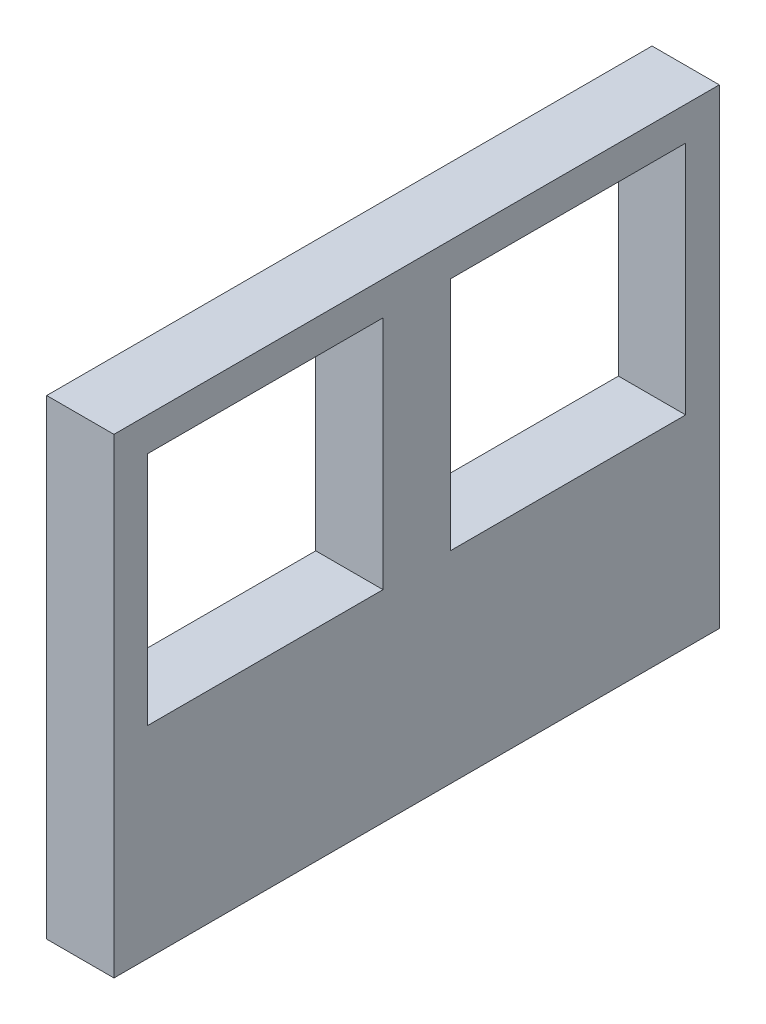
ISO-10303-21;
HEADER;
FILE_DESCRIPTION(('STEP AP214'),'2;1');
FILE_NAME('part.step','',(''),(''),'','','');
FILE_SCHEMA(('AUTOMOTIVE_DESIGN { 1 0 10303 214 1 1 1 1 }'));
ENDSEC;
DATA;
#1=APPLICATION_CONTEXT('core data for automotive mechanical design processes');
#2=APPLICATION_PROTOCOL_DEFINITION('international standard','automotive_design',2000,#1);
#3=PRODUCT_CONTEXT('',#1,'mechanical');
#4=PRODUCT('Part','Part','',(#3));
#5=PRODUCT_RELATED_PRODUCT_CATEGORY('part','',(#4));
#6=PRODUCT_DEFINITION_FORMATION('','',#4);
#7=PRODUCT_DEFINITION_CONTEXT('part definition',#1,'design');
#8=PRODUCT_DEFINITION('design','',#6,#7);
#9=PRODUCT_DEFINITION_SHAPE('','',#8);
#10=(LENGTH_UNIT() NAMED_UNIT(*) SI_UNIT(.MILLI.,.METRE.));
#11=(NAMED_UNIT(*) PLANE_ANGLE_UNIT() SI_UNIT($,.RADIAN.));
#12=(NAMED_UNIT(*) SI_UNIT($,.STERADIAN.) SOLID_ANGLE_UNIT());
#13=UNCERTAINTY_MEASURE_WITH_UNIT(LENGTH_MEASURE(1.E-05),#10,'distance_accuracy_value','');
#14=(GEOMETRIC_REPRESENTATION_CONTEXT(3) GLOBAL_UNCERTAINTY_ASSIGNED_CONTEXT((#13)) GLOBAL_UNIT_ASSIGNED_CONTEXT((#10,
#11,#12)) REPRESENTATION_CONTEXT('',''));
#15=CARTESIAN_POINT('',(0.,0.,0.));
#16=DIRECTION('',(0.,0.,1.));
#17=DIRECTION('',(1.,0.,0.));
#18=AXIS2_PLACEMENT_3D('',#15,#16,#17);
#19=CARTESIAN_POINT('',(4.00000000100669,0.,0.));
#20=DIRECTION('',(1.,-1.53139024142648E-11,1.01128581309604E-11));
#21=DIRECTION('',(1.53139024142648E-11,1.,0.));
#22=AXIS2_PLACEMENT_3D('',#19,#20,#21);
#23=PLANE('',#22);
#24=DIRECTION('',(1.53547098167227E-11,1.,0.));
#25=VECTOR('',#24,1.);
#26=CARTESIAN_POINT('',(4.00000000073447,-27.529244173444,5.24235772495873));
#27=LINE('',#26,#25);
#28=CARTESIAN_POINT('',(4.00000000073447,-27.529244173444,5.24235772495873));
#29=VERTEX_POINT('',#28);
#30=CARTESIAN_POINT('',(4.00000000074649,-13.529244173444,5.24235772495794));
#31=VERTEX_POINT('',#30);
#32=EDGE_CURVE('E166',#29,#31,#27,.T.);
#33=ORIENTED_EDGE('',*,*,#32,.F.);
#34=DIRECTION('',(1.06786305254557E-11,0.,-1.));
#35=VECTOR('',#34,1.);
#36=CARTESIAN_POINT('',(4.00000000073447,-27.529244173444,5.24235772495873));
#37=LINE('',#36,#35);
#38=CARTESIAN_POINT('',(4.00000000058497,-27.5292441734432,19.2423577249587));
#39=VERTEX_POINT('',#38);
#40=EDGE_CURVE('E143',#39,#29,#37,.T.);
#41=ORIENTED_EDGE('',*,*,#40,.F.);
#42=DIRECTION('',(-1.53547098167227E-11,-1.,0.));
#43=VECTOR('',#42,1.);
#44=CARTESIAN_POINT('',(4.00000000058497,-27.5292441734432,19.2423577249587));
#45=LINE('',#44,#43);
#46=CARTESIAN_POINT('',(4.00000000079993,-13.5292441734432,19.2423577249579));
#47=VERTEX_POINT('',#46);
#48=EDGE_CURVE('E136',#47,#39,#45,.T.);
#49=ORIENTED_EDGE('',*,*,#48,.F.);
#50=DIRECTION('',(-1.06786305254557E-11,0.,1.));
#51=VECTOR('',#50,1.);
#52=CARTESIAN_POINT('',(4.00000000094943,-13.529244173444,5.24235772495794));
#53=LINE('',#52,#51);
#54=EDGE_CURVE('E125',#31,#47,#53,.T.);
#55=ORIENTED_EDGE('',*,*,#54,.F.);
#56=EDGE_LOOP('',(#33,#41,#49,#55));
#57=FACE_BOUND('',#56,.T.);
#58=DIRECTION('',(1.53547096352157E-11,1.,0.));
#59=VECTOR('',#58,1.);
#60=CARTESIAN_POINT('',(4.00000000092668,-27.529244173445,-12.7576422750412));
#61=LINE('',#60,#59);
#62=CARTESIAN_POINT('',(4.00000000092668,-27.529244173445,-12.7576422750412));
#63=VERTEX_POINT('',#62);
#64=CARTESIAN_POINT('',(4.00000000092852,-13.529244173445,-12.757642275042));
#65=VERTEX_POINT('',#64);
#66=EDGE_CURVE('E198',#63,#65,#61,.T.);
#67=ORIENTED_EDGE('',*,*,#66,.F.);
#68=DIRECTION('',(1.06786305254557E-11,0.,-1.));
#69=VECTOR('',#68,1.);
#70=CARTESIAN_POINT('',(4.00000000092668,-27.529244173445,-12.7576422750412));
#71=LINE('',#70,#69);
#72=CARTESIAN_POINT('',(4.00000000077718,-27.5292441734443,1.24235772495875));
#73=VERTEX_POINT('',#72);
#74=EDGE_CURVE('E171',#73,#63,#71,.T.);
#75=ORIENTED_EDGE('',*,*,#74,.F.);
#76=DIRECTION('',(-1.53547096352157E-11,-1.,0.));
#77=VECTOR('',#76,1.);
#78=CARTESIAN_POINT('',(4.00000000077718,-27.5292441734442,1.24235772495875));
#79=LINE('',#78,#77);
#80=CARTESIAN_POINT('',(4.00000000099215,-13.5292441734442,1.24235772495796));
#81=VERTEX_POINT('',#80);
#82=EDGE_CURVE('E191',#81,#73,#79,.T.);
#83=ORIENTED_EDGE('',*,*,#82,.F.);
#84=DIRECTION('',(-1.06786305254557E-11,0.,1.));
#85=VECTOR('',#84,1.);
#86=CARTESIAN_POINT('',(4.00000000114165,-13.529244173445,-12.757642275042));
#87=LINE('',#86,#85);
#88=EDGE_CURVE('E184',#65,#81,#87,.T.);
#89=ORIENTED_EDGE('',*,*,#88,.F.);
#90=EDGE_LOOP('',(#67,#75,#83,#89));
#91=FACE_BOUND('',#90,.T.);
#92=DIRECTION('',(1.53545343286841E-11,1.,0.));
#93=VECTOR('',#92,1.);
#94=CARTESIAN_POINT('',(4.00000000037936,-39.5292441734502,21.2423577249608));
#95=LINE('',#94,#93);
#96=CARTESIAN_POINT('',(4.00000000037936,-39.5292441734502,21.2423577249608));
#97=VERTEX_POINT('',#96);
#98=CARTESIAN_POINT('',(4.00000000080929,-11.5292441734504,21.2423577249592));
#99=VERTEX_POINT('',#98);
#100=EDGE_CURVE('E46',#97,#99,#95,.T.);
#101=ORIENTED_EDGE('',*,*,#100,.F.);
#102=DIRECTION('',(-1.06783779595951E-11,0.,1.));
#103=VECTOR('',#102,1.);
#104=CARTESIAN_POINT('',(4.00000000076378,-39.5292441734522,-14.7576422750417));
#105=LINE('',#104,#103);
#106=CARTESIAN_POINT('',(4.00000000076378,-39.5292441734522,-14.7576422750417));
#107=VERTEX_POINT('',#106);
#108=EDGE_CURVE('E183',#107,#97,#105,.T.);
#109=ORIENTED_EDGE('',*,*,#108,.F.);
#110=DIRECTION('',(-1.53546596069565E-11,-1.,0.));
#111=VECTOR('',#110,1.);
#112=CARTESIAN_POINT('',(4.00000000076378,-39.5292441734522,-14.7576422750417));
#113=LINE('',#112,#111);
#114=CARTESIAN_POINT('',(4.00000000119371,-11.5292441734525,-14.7576422750433));
#115=VERTEX_POINT('',#114);
#116=EDGE_CURVE('E229',#115,#107,#113,.T.);
#117=ORIENTED_EDGE('',*,*,#116,.F.);
#118=DIRECTION('',(1.06784753982515E-11,0.,-1.));
#119=VECTOR('',#118,1.);
#120=CARTESIAN_POINT('',(4.00000000119371,-11.5292441734525,-14.7576422750433));
#121=LINE('',#120,#119);
#122=EDGE_CURVE('E244',#99,#115,#121,.T.);
#123=ORIENTED_EDGE('',*,*,#122,.F.);
#124=EDGE_LOOP('',(#101,#109,#117,#123));
#125=FACE_BOUND('',#124,.T.);
#126=ADVANCED_FACE('F38',(#57,#91,#125),#23,.T.);
#127=CARTESIAN_POINT('',(1.00668872198654E-09,0.,0.));
#128=DIRECTION('',(1.,-1.53139024142648E-11,1.01128581309604E-11));
#129=DIRECTION('',(1.53139024142648E-11,1.,0.));
#130=AXIS2_PLACEMENT_3D('',#127,#128,#129);
#131=PLANE('',#130);
#132=DIRECTION('',(1.06786305254557E-11,0.,-1.));
#133=VECTOR('',#132,1.);
#134=CARTESIAN_POINT('',(7.34468521226502E-10,-27.529244173444,5.24235772495873));
#135=LINE('',#134,#133);
#136=CARTESIAN_POINT('',(5.84967693870122E-10,-27.5292441734432,19.2423577249587));
#137=VERTEX_POINT('',#136);
#138=CARTESIAN_POINT('',(7.34468521226502E-10,-27.529244173444,5.24235772495873));
#139=VERTEX_POINT('',#138);
#140=EDGE_CURVE('E144',#137,#139,#135,.T.);
#141=ORIENTED_EDGE('',*,*,#140,.T.);
#142=DIRECTION('',(1.53547098167227E-11,1.,0.));
#143=VECTOR('',#142,1.);
#144=CARTESIAN_POINT('',(7.34468521226502E-10,-27.529244173444,5.24235772495873));
#145=LINE('',#144,#143);
#146=CARTESIAN_POINT('',(9.4943445866062E-10,-13.529244173444,5.24235772495794));
#147=VERTEX_POINT('',#146);
#148=EDGE_CURVE('E165',#139,#147,#145,.T.);
#149=ORIENTED_EDGE('',*,*,#148,.T.);
#150=DIRECTION('',(-1.06786305254557E-11,0.,1.));
#151=VECTOR('',#150,1.);
#152=CARTESIAN_POINT('',(9.4943445866062E-10,-13.529244173444,5.24235772495794));
#153=LINE('',#152,#151);
#154=CARTESIAN_POINT('',(6.04907963197976E-10,-13.5292441734432,19.2423577249579));
#155=VERTEX_POINT('',#154);
#156=EDGE_CURVE('E130',#147,#155,#153,.T.);
#157=ORIENTED_EDGE('',*,*,#156,.T.);
#158=DIRECTION('',(-1.53547098167227E-11,-1.,0.));
#159=VECTOR('',#158,1.);
#160=CARTESIAN_POINT('',(5.84967693870122E-10,-27.5292441734432,19.2423577249587));
#161=LINE('',#160,#159);
#162=EDGE_CURVE('E131',#155,#137,#161,.T.);
#163=ORIENTED_EDGE('',*,*,#162,.T.);
#164=EDGE_LOOP('',(#141,#149,#157,#163));
#165=FACE_BOUND('',#164,.T.);
#166=DIRECTION('',(1.06786305254557E-11,0.,-1.));
#167=VECTOR('',#166,1.);
#168=CARTESIAN_POINT('',(9.26684423609647E-10,-27.529244173445,-12.7576422750412));
#169=LINE('',#168,#167);
#170=CARTESIAN_POINT('',(7.77183596253268E-10,-27.5292441734443,1.24235772495875));
#171=VERTEX_POINT('',#170);
#172=CARTESIAN_POINT('',(9.26684423609647E-10,-27.529244173445,-12.7576422750412));
#173=VERTEX_POINT('',#172);
#174=EDGE_CURVE('E207',#171,#173,#169,.T.);
#175=ORIENTED_EDGE('',*,*,#174,.T.);
#176=DIRECTION('',(1.53547096352157E-11,1.,0.));
#177=VECTOR('',#176,1.);
#178=CARTESIAN_POINT('',(9.26684423609647E-10,-27.529244173445,-12.7576422750412));
#179=LINE('',#178,#177);
#180=CARTESIAN_POINT('',(1.14165035850267E-09,-13.529244173445,-12.757642275042));
#181=VERTEX_POINT('',#180);
#182=EDGE_CURVE('E172',#173,#181,#179,.T.);
#183=ORIENTED_EDGE('',*,*,#182,.T.);
#184=DIRECTION('',(-1.06786305254557E-11,0.,1.));
#185=VECTOR('',#184,1.);
#186=CARTESIAN_POINT('',(1.14165035850267E-09,-13.529244173445,-12.757642275042));
#187=LINE('',#186,#185);
#188=CARTESIAN_POINT('',(7.86939409555247E-10,-13.5292441734442,1.24235772495796));
#189=VERTEX_POINT('',#188);
#190=EDGE_CURVE('E180',#181,#189,#187,.T.);
#191=ORIENTED_EDGE('',*,*,#190,.T.);
#192=DIRECTION('',(-1.53547096352157E-11,-1.,0.));
#193=VECTOR('',#192,1.);
#194=CARTESIAN_POINT('',(7.77183596253268E-10,-27.5292441734442,1.24235772495875));
#195=LINE('',#194,#193);
#196=EDGE_CURVE('E190',#189,#171,#195,.T.);
#197=ORIENTED_EDGE('',*,*,#196,.T.);
#198=EDGE_LOOP('',(#175,#183,#191,#197));
#199=FACE_BOUND('',#198,.T.);
#200=DIRECTION('',(1.53545343286841E-11,1.,0.));
#201=VECTOR('',#200,1.);
#202=CARTESIAN_POINT('',(3.79359720536706E-10,-39.5292441734502,21.2423577249608));
#203=LINE('',#202,#201);
#204=CARTESIAN_POINT('',(3.79359720536706E-10,-39.5292441734502,21.2423577249608));
#205=VERTEX_POINT('',#204);
#206=CARTESIAN_POINT('',(8.09286681739858E-10,-11.5292441734504,21.2423577249592));
#207=VERTEX_POINT('',#206);
#208=EDGE_CURVE('E12',#205,#207,#203,.T.);
#209=ORIENTED_EDGE('',*,*,#208,.T.);
#210=DIRECTION('',(1.06784753982515E-11,0.,-1.));
#211=VECTOR('',#210,1.);
#212=CARTESIAN_POINT('',(1.19371179607694E-09,-11.5292441734525,-14.7576422750433));
#213=LINE('',#212,#211);
#214=CARTESIAN_POINT('',(1.19371179607694E-09,-11.5292441734525,-14.7576422750433));
#215=VERTEX_POINT('',#214);
#216=EDGE_CURVE('E243',#207,#215,#213,.T.);
#217=ORIENTED_EDGE('',*,*,#216,.T.);
#218=DIRECTION('',(-1.53546596069565E-11,-1.,0.));
#219=VECTOR('',#218,1.);
#220=CARTESIAN_POINT('',(7.63781327082158E-10,-39.5292441734522,-14.7576422750417));
#221=LINE('',#220,#219);
#222=CARTESIAN_POINT('',(7.63781327082158E-10,-39.5292441734522,-14.7576422750417));
#223=VERTEX_POINT('',#222);
#224=EDGE_CURVE('E258',#215,#223,#221,.T.);
#225=ORIENTED_EDGE('',*,*,#224,.T.);
#226=DIRECTION('',(-1.06783779595951E-11,0.,1.));
#227=VECTOR('',#226,1.);
#228=CARTESIAN_POINT('',(7.63781327082158E-10,-39.5292441734522,-14.7576422750417));
#229=LINE('',#228,#227);
#230=EDGE_CURVE('E230',#223,#205,#229,.T.);
#231=ORIENTED_EDGE('',*,*,#230,.T.);
#232=EDGE_LOOP('',(#209,#217,#225,#231));
#233=FACE_BOUND('',#232,.T.);
#234=ADVANCED_FACE('F290',(#165,#199,#233),#131,.F.);
#235=CARTESIAN_POINT('',(7.63781327082158E-10,-39.5292441734522,-14.7576422750417));
#236=DIRECTION('',(0.,1.,0.));
#237=DIRECTION('',(0.,0.,1.));
#238=AXIS2_PLACEMENT_3D('',#235,#236,#237);
#239=PLANE('',#238);
#240=ORIENTED_EDGE('',*,*,#108,.T.);
#241=DIRECTION('',(1.,0.,0.));
#242=VECTOR('',#241,1.);
#243=CARTESIAN_POINT('',(3.79359720536706E-10,-39.5292441734502,21.2423577249608));
#244=LINE('',#243,#242);
#245=EDGE_CURVE('E226',#205,#97,#244,.T.);
#246=ORIENTED_EDGE('',*,*,#245,.F.);
#247=ORIENTED_EDGE('',*,*,#230,.F.);
#248=DIRECTION('',(1.,0.,0.));
#249=VECTOR('',#248,1.);
#250=CARTESIAN_POINT('',(7.63781327082158E-10,-39.5292441734522,-14.7576422750417));
#251=LINE('',#250,#249);
#252=EDGE_CURVE('E235',#223,#107,#251,.T.);
#253=ORIENTED_EDGE('',*,*,#252,.T.);
#254=EDGE_LOOP('',(#240,#246,#247,#253));
#255=FACE_BOUND('',#254,.T.);
#256=ADVANCED_FACE('F276',(#255),#239,.F.);
#257=CARTESIAN_POINT('',(7.63781327082158E-10,-39.5292441734522,-14.7576422750417));
#258=DIRECTION('',(0.,0.,1.));
#259=DIRECTION('',(0.,-1.,0.));
#260=AXIS2_PLACEMENT_3D('',#257,#258,#259);
#261=PLANE('',#260);
#262=ORIENTED_EDGE('',*,*,#116,.T.);
#263=ORIENTED_EDGE('',*,*,#252,.F.);
#264=ORIENTED_EDGE('',*,*,#224,.F.);
#265=DIRECTION('',(1.,0.,0.));
#266=VECTOR('',#265,1.);
#267=CARTESIAN_POINT('',(1.19371179607694E-09,-11.5292441734525,-14.7576422750433));
#268=LINE('',#267,#266);
#269=EDGE_CURVE('E261',#215,#115,#268,.T.);
#270=ORIENTED_EDGE('',*,*,#269,.T.);
#271=EDGE_LOOP('',(#262,#263,#264,#270));
#272=FACE_BOUND('',#271,.T.);
#273=ADVANCED_FACE('F291',(#272),#261,.F.);
#274=CARTESIAN_POINT('',(1.19371179607694E-09,-11.5292441734525,-14.7576422750433));
#275=DIRECTION('',(0.,-1.,0.));
#276=DIRECTION('',(0.,0.,-1.));
#277=AXIS2_PLACEMENT_3D('',#274,#275,#276);
#278=PLANE('',#277);
#279=ORIENTED_EDGE('',*,*,#122,.T.);
#280=ORIENTED_EDGE('',*,*,#269,.F.);
#281=ORIENTED_EDGE('',*,*,#216,.F.);
#282=DIRECTION('',(1.,0.,0.));
#283=VECTOR('',#282,1.);
#284=CARTESIAN_POINT('',(8.09286681739858E-10,-11.5292441734504,21.2423577249592));
#285=LINE('',#284,#283);
#286=EDGE_CURVE('E240',#207,#99,#285,.T.);
#287=ORIENTED_EDGE('',*,*,#286,.T.);
#288=EDGE_LOOP('',(#279,#280,#281,#287));
#289=FACE_BOUND('',#288,.T.);
#290=ADVANCED_FACE('F287',(#289),#278,.F.);
#291=CARTESIAN_POINT('',(3.79359720536706E-10,-39.5292441734502,21.2423577249608));
#292=DIRECTION('',(0.,0.,-1.));
#293=DIRECTION('',(0.,1.,0.));
#294=AXIS2_PLACEMENT_3D('',#291,#292,#293);
#295=PLANE('',#294);
#296=ORIENTED_EDGE('',*,*,#100,.T.);
#297=ORIENTED_EDGE('',*,*,#286,.F.);
#298=ORIENTED_EDGE('',*,*,#208,.F.);
#299=ORIENTED_EDGE('',*,*,#245,.T.);
#300=EDGE_LOOP('',(#296,#297,#298,#299));
#301=FACE_BOUND('',#300,.T.);
#302=ADVANCED_FACE('F285',(#301),#295,.F.);
#303=CARTESIAN_POINT('',(9.26684423609647E-10,-27.529244173445,-12.7576422750412));
#304=DIRECTION('',(0.,0.,-1.));
#305=DIRECTION('',(0.,1.,0.));
#306=AXIS2_PLACEMENT_3D('',#303,#304,#305);
#307=PLANE('',#306);
#308=ORIENTED_EDGE('',*,*,#66,.T.);
#309=DIRECTION('',(1.,0.,0.));
#310=VECTOR('',#309,1.);
#311=CARTESIAN_POINT('',(1.14165035850267E-09,-13.529244173445,-12.757642275042));
#312=LINE('',#311,#310);
#313=EDGE_CURVE('E169',#181,#65,#312,.T.);
#314=ORIENTED_EDGE('',*,*,#313,.F.);
#315=ORIENTED_EDGE('',*,*,#182,.F.);
#316=DIRECTION('',(1.,0.,0.));
#317=VECTOR('',#316,1.);
#318=CARTESIAN_POINT('',(9.26684423609647E-10,-27.529244173445,-12.7576422750412));
#319=LINE('',#318,#317);
#320=EDGE_CURVE('E177',#173,#63,#319,.T.);
#321=ORIENTED_EDGE('',*,*,#320,.T.);
#322=EDGE_LOOP('',(#308,#314,#315,#321));
#323=FACE_BOUND('',#322,.T.);
#324=ADVANCED_FACE('F301',(#323),#307,.F.);
#325=CARTESIAN_POINT('',(9.26684423609647E-10,-27.529244173445,-12.7576422750412));
#326=DIRECTION('',(0.,-1.,0.));
#327=DIRECTION('',(0.,0.,-1.));
#328=AXIS2_PLACEMENT_3D('',#325,#326,#327);
#329=PLANE('',#328);
#330=ORIENTED_EDGE('',*,*,#74,.T.);
#331=ORIENTED_EDGE('',*,*,#320,.F.);
#332=ORIENTED_EDGE('',*,*,#174,.F.);
#333=DIRECTION('',(1.,0.,0.));
#334=VECTOR('',#333,1.);
#335=CARTESIAN_POINT('',(7.77183596253268E-10,-27.5292441734442,1.24235772495875));
#336=LINE('',#335,#334);
#337=EDGE_CURVE('E210',#171,#73,#336,.T.);
#338=ORIENTED_EDGE('',*,*,#337,.T.);
#339=EDGE_LOOP('',(#330,#331,#332,#338));
#340=FACE_BOUND('',#339,.T.);
#341=ADVANCED_FACE('F306',(#340),#329,.F.);
#342=CARTESIAN_POINT('',(7.77183596253268E-10,-27.5292441734442,1.24235772495875));
#343=DIRECTION('',(0.,0.,1.));
#344=DIRECTION('',(0.,-1.,0.));
#345=AXIS2_PLACEMENT_3D('',#342,#343,#344);
#346=PLANE('',#345);
#347=ORIENTED_EDGE('',*,*,#82,.T.);
#348=ORIENTED_EDGE('',*,*,#337,.F.);
#349=ORIENTED_EDGE('',*,*,#196,.F.);
#350=DIRECTION('',(1.,0.,0.));
#351=VECTOR('',#350,1.);
#352=CARTESIAN_POINT('',(9.92149531146287E-10,-13.5292441734442,1.24235772495796));
#353=LINE('',#352,#351);
#354=EDGE_CURVE('E187',#189,#81,#353,.T.);
#355=ORIENTED_EDGE('',*,*,#354,.T.);
#356=EDGE_LOOP('',(#347,#348,#349,#355));
#357=FACE_BOUND('',#356,.T.);
#358=ADVANCED_FACE('F323',(#357),#346,.F.);
#359=CARTESIAN_POINT('',(1.14165035850267E-09,-13.529244173445,-12.757642275042));
#360=DIRECTION('',(0.,1.,0.));
#361=DIRECTION('',(0.,0.,1.));
#362=AXIS2_PLACEMENT_3D('',#359,#360,#361);
#363=PLANE('',#362);
#364=ORIENTED_EDGE('',*,*,#88,.T.);
#365=ORIENTED_EDGE('',*,*,#354,.F.);
#366=ORIENTED_EDGE('',*,*,#190,.F.);
#367=ORIENTED_EDGE('',*,*,#313,.T.);
#368=EDGE_LOOP('',(#364,#365,#366,#367));
#369=FACE_BOUND('',#368,.T.);
#370=ADVANCED_FACE('F314',(#369),#363,.F.);
#371=CARTESIAN_POINT('',(7.34468521226502E-10,-27.529244173444,5.24235772495873));
#372=DIRECTION('',(0.,0.,-1.));
#373=DIRECTION('',(0.,1.,0.));
#374=AXIS2_PLACEMENT_3D('',#371,#372,#373);
#375=PLANE('',#374);
#376=ORIENTED_EDGE('',*,*,#32,.T.);
#377=DIRECTION('',(1.,0.,0.));
#378=VECTOR('',#377,1.);
#379=CARTESIAN_POINT('',(9.4943445866062E-10,-13.529244173444,5.24235772495794));
#380=LINE('',#379,#378);
#381=EDGE_CURVE('E54',#147,#31,#380,.T.);
#382=ORIENTED_EDGE('',*,*,#381,.F.);
#383=ORIENTED_EDGE('',*,*,#148,.F.);
#384=DIRECTION('',(1.,0.,0.));
#385=VECTOR('',#384,1.);
#386=CARTESIAN_POINT('',(7.34468521226502E-10,-27.529244173444,5.24235772495873));
#387=LINE('',#386,#385);
#388=EDGE_CURVE('E162',#139,#29,#387,.T.);
#389=ORIENTED_EDGE('',*,*,#388,.T.);
#390=EDGE_LOOP('',(#376,#382,#383,#389));
#391=FACE_BOUND('',#390,.T.);
#392=ADVANCED_FACE('F330',(#391),#375,.F.);
#393=CARTESIAN_POINT('',(7.34468521226502E-10,-27.529244173444,5.24235772495873));
#394=DIRECTION('',(0.,-1.,0.));
#395=DIRECTION('',(0.,0.,-1.));
#396=AXIS2_PLACEMENT_3D('',#393,#394,#395);
#397=PLANE('',#396);
#398=ORIENTED_EDGE('',*,*,#40,.T.);
#399=ORIENTED_EDGE('',*,*,#388,.F.);
#400=ORIENTED_EDGE('',*,*,#140,.F.);
#401=DIRECTION('',(1.,0.,0.));
#402=VECTOR('',#401,1.);
#403=CARTESIAN_POINT('',(5.84967693870122E-10,-27.5292441734432,19.2423577249587));
#404=LINE('',#403,#402);
#405=EDGE_CURVE('E147',#137,#39,#404,.T.);
#406=ORIENTED_EDGE('',*,*,#405,.T.);
#407=EDGE_LOOP('',(#398,#399,#400,#406));
#408=FACE_BOUND('',#407,.T.);
#409=ADVANCED_FACE('F336',(#408),#397,.F.);
#410=CARTESIAN_POINT('',(5.84967693870122E-10,-27.5292441734432,19.2423577249587));
#411=DIRECTION('',(0.,0.,1.));
#412=DIRECTION('',(0.,-1.,0.));
#413=AXIS2_PLACEMENT_3D('',#410,#411,#412);
#414=PLANE('',#413);
#415=ORIENTED_EDGE('',*,*,#48,.T.);
#416=ORIENTED_EDGE('',*,*,#405,.F.);
#417=ORIENTED_EDGE('',*,*,#162,.F.);
#418=DIRECTION('',(1.,0.,0.));
#419=VECTOR('',#418,1.);
#420=CARTESIAN_POINT('',(7.99933631304241E-10,-13.5292441734432,19.2423577249579));
#421=LINE('',#420,#419);
#422=EDGE_CURVE('E59',#155,#47,#421,.T.);
#423=ORIENTED_EDGE('',*,*,#422,.T.);
#424=EDGE_LOOP('',(#415,#416,#417,#423));
#425=FACE_BOUND('',#424,.T.);
#426=ADVANCED_FACE('F134',(#425),#414,.F.);
#427=CARTESIAN_POINT('',(9.4943445866062E-10,-13.529244173444,5.24235772495794));
#428=DIRECTION('',(0.,1.,0.));
#429=DIRECTION('',(0.,0.,1.));
#430=AXIS2_PLACEMENT_3D('',#427,#428,#429);
#431=PLANE('',#430);
#432=ORIENTED_EDGE('',*,*,#54,.T.);
#433=ORIENTED_EDGE('',*,*,#422,.F.);
#434=ORIENTED_EDGE('',*,*,#156,.F.);
#435=ORIENTED_EDGE('',*,*,#381,.T.);
#436=EDGE_LOOP('',(#432,#433,#434,#435));
#437=FACE_BOUND('',#436,.T.);
#438=ADVANCED_FACE('F126',(#437),#431,.F.);
#439=CLOSED_SHELL('',(#126,#234,#256,#273,#290,#302,#324,#341,#358,#370,#392,#409,#426,#438));
#440=MANIFOLD_SOLID_BREP('B2',#439);
#441=ADVANCED_BREP_SHAPE_REPRESENTATION('',(#18,#440),#14);
#442=SHAPE_DEFINITION_REPRESENTATION(#9,#441);
ENDSEC;
END-ISO-10303-21;
